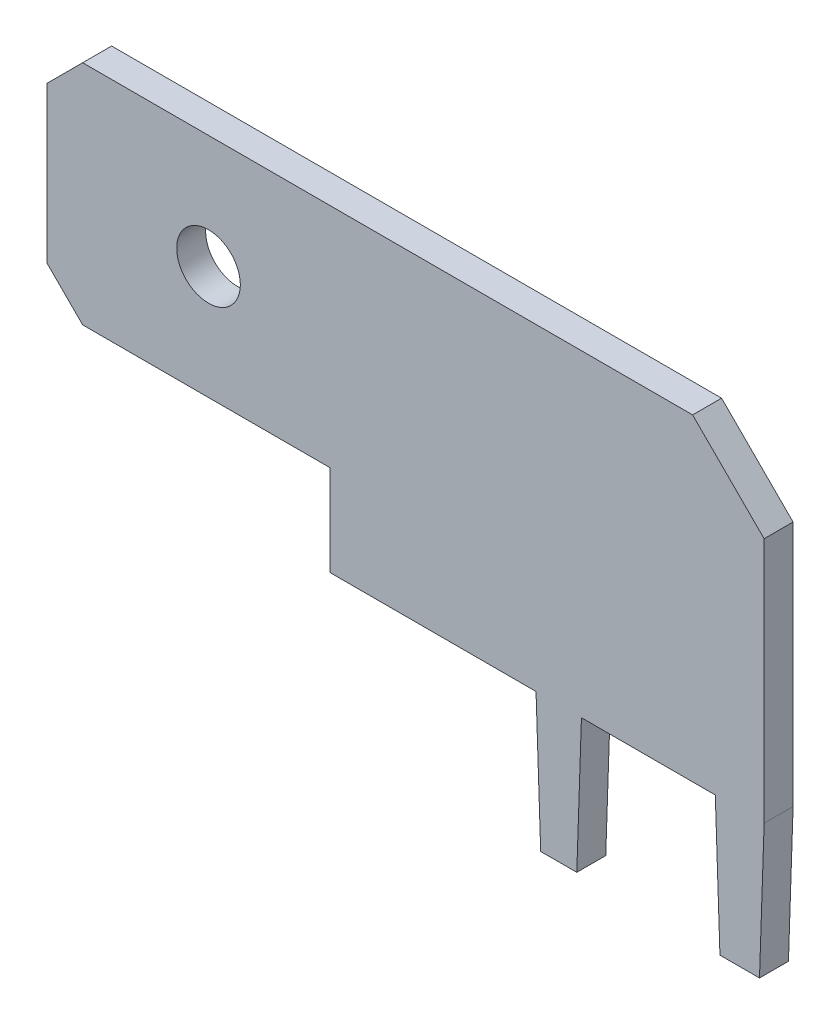
ISO-10303-21;
HEADER;
FILE_DESCRIPTION(('STEP AP214'),'2;1');
FILE_NAME('part.step','',(''),(''),'','','');
FILE_SCHEMA(('AUTOMOTIVE_DESIGN { 1 0 10303 214 1 1 1 1 }'));
ENDSEC;
DATA;
#1=APPLICATION_CONTEXT('core data for automotive mechanical design processes');
#2=APPLICATION_PROTOCOL_DEFINITION('international standard','automotive_design',2000,#1);
#3=PRODUCT_CONTEXT('',#1,'mechanical');
#4=PRODUCT('Part','Part','',(#3));
#5=PRODUCT_RELATED_PRODUCT_CATEGORY('part','',(#4));
#6=PRODUCT_DEFINITION_FORMATION('','',#4);
#7=PRODUCT_DEFINITION_CONTEXT('part definition',#1,'design');
#8=PRODUCT_DEFINITION('design','',#6,#7);
#9=PRODUCT_DEFINITION_SHAPE('','',#8);
#10=(LENGTH_UNIT() NAMED_UNIT(*) SI_UNIT(.MILLI.,.METRE.));
#11=(NAMED_UNIT(*) PLANE_ANGLE_UNIT() SI_UNIT($,.RADIAN.));
#12=(NAMED_UNIT(*) SI_UNIT($,.STERADIAN.) SOLID_ANGLE_UNIT());
#13=UNCERTAINTY_MEASURE_WITH_UNIT(LENGTH_MEASURE(1.E-05),#10,'distance_accuracy_value','');
#14=(GEOMETRIC_REPRESENTATION_CONTEXT(3) GLOBAL_UNCERTAINTY_ASSIGNED_CONTEXT((#13)) GLOBAL_UNIT_ASSIGNED_CONTEXT((#10,
#11,#12)) REPRESENTATION_CONTEXT('',''));
#15=CARTESIAN_POINT('',(0.,0.,0.));
#16=DIRECTION('',(0.,0.,1.));
#17=DIRECTION('',(1.,0.,0.));
#18=AXIS2_PLACEMENT_3D('',#15,#16,#17);
#19=CARTESIAN_POINT('',(-13.1040739404569,11.3618519963259,0.81));
#20=DIRECTION('',(0.707106781186549,-0.707106781186546,0.));
#21=DIRECTION('',(0.707106781186546,0.707106781186549,0.));
#22=AXIS2_PLACEMENT_3D('',#19,#20,#21);
#23=PLANE('',#22);
#24=DIRECTION('',(-0.707106781186546,-0.707106781186549,0.));
#25=VECTOR('',#24,1.);
#26=CARTESIAN_POINT('',(-13.1040739404569,11.3618519963259,0.));
#27=LINE('',#26,#25);
#28=CARTESIAN_POINT('',(-13.1040739404569,11.3618519963259,0.));
#29=VERTEX_POINT('',#28);
#30=CARTESIAN_POINT('',(-14.1040739404569,10.3618519963258,0.));
#31=VERTEX_POINT('',#30);
#32=EDGE_CURVE('E177',#29,#31,#27,.T.);
#33=ORIENTED_EDGE('',*,*,#32,.T.);
#34=DIRECTION('',(0.,0.,-1.));
#35=VECTOR('',#34,1.);
#36=CARTESIAN_POINT('',(-14.1040739404569,10.3618519963258,0.81));
#37=LINE('',#36,#35);
#38=CARTESIAN_POINT('',(-14.1040739404569,10.3618519963258,0.81));
#39=VERTEX_POINT('',#38);
#40=EDGE_CURVE('E11',#39,#31,#37,.T.);
#41=ORIENTED_EDGE('',*,*,#40,.F.);
#42=DIRECTION('',(-0.707106781186546,-0.707106781186549,0.));
#43=VECTOR('',#42,1.);
#44=CARTESIAN_POINT('',(-13.1040739404569,11.3618519963259,0.81));
#45=LINE('',#44,#43);
#46=CARTESIAN_POINT('',(-13.1040739404569,11.3618519963259,0.81));
#47=VERTEX_POINT('',#46);
#48=EDGE_CURVE('E208',#47,#39,#45,.T.);
#49=ORIENTED_EDGE('',*,*,#48,.F.);
#50=DIRECTION('',(0.,0.,-1.));
#51=VECTOR('',#50,1.);
#52=CARTESIAN_POINT('',(-13.1040739404569,11.3618519963259,0.81));
#53=LINE('',#52,#51);
#54=EDGE_CURVE('E173',#47,#29,#53,.T.);
#55=ORIENTED_EDGE('',*,*,#54,.T.);
#56=EDGE_LOOP('',(#33,#41,#49,#55));
#57=FACE_BOUND('',#56,.T.);
#58=ADVANCED_FACE('F33',(#57),#23,.F.);
#59=CARTESIAN_POINT('',(-14.1040739404569,6.01185199632586,0.81));
#60=DIRECTION('',(1.,0.,0.));
#61=DIRECTION('',(0.,1.,0.));
#62=AXIS2_PLACEMENT_3D('',#59,#60,#61);
#63=PLANE('',#62);
#64=DIRECTION('',(0.,-1.,0.));
#65=VECTOR('',#64,1.);
#66=CARTESIAN_POINT('',(-14.1040739404569,6.01185199632586,0.));
#67=LINE('',#66,#65);
#68=CARTESIAN_POINT('',(-14.1040739404569,6.01185199632586,0.));
#69=VERTEX_POINT('',#68);
#70=EDGE_CURVE('E180',#31,#69,#67,.T.);
#71=ORIENTED_EDGE('',*,*,#70,.T.);
#72=DIRECTION('',(0.,0.,-1.));
#73=VECTOR('',#72,1.);
#74=CARTESIAN_POINT('',(-14.1040739404569,6.01185199632586,0.81));
#75=LINE('',#74,#73);
#76=CARTESIAN_POINT('',(-14.1040739404569,6.01185199632586,0.81));
#77=VERTEX_POINT('',#76);
#78=EDGE_CURVE('E41',#77,#69,#75,.T.);
#79=ORIENTED_EDGE('',*,*,#78,.F.);
#80=DIRECTION('',(0.,-1.,0.));
#81=VECTOR('',#80,1.);
#82=CARTESIAN_POINT('',(-14.1040739404569,6.01185199632586,0.81));
#83=LINE('',#82,#81);
#84=EDGE_CURVE('E116',#39,#77,#83,.T.);
#85=ORIENTED_EDGE('',*,*,#84,.F.);
#86=ORIENTED_EDGE('',*,*,#40,.T.);
#87=EDGE_LOOP('',(#71,#79,#85,#86));
#88=FACE_BOUND('',#87,.T.);
#89=ADVANCED_FACE('F307',(#88),#63,.F.);
#90=CARTESIAN_POINT('',(-14.1040739404569,6.01185199632586,0.81));
#91=DIRECTION('',(0.707106781186548,0.707106781186548,0.));
#92=DIRECTION('',(-0.707106781186548,0.707106781186548,0.));
#93=AXIS2_PLACEMENT_3D('',#90,#91,#92);
#94=PLANE('',#93);
#95=DIRECTION('',(0.707106781186547,-0.707106781186547,0.));
#96=VECTOR('',#95,1.);
#97=CARTESIAN_POINT('',(-14.1040739404569,6.01185199632586,0.));
#98=LINE('',#97,#96);
#99=CARTESIAN_POINT('',(-13.1040739404569,5.01185199632586,0.));
#100=VERTEX_POINT('',#99);
#101=EDGE_CURVE('E183',#69,#100,#98,.T.);
#102=ORIENTED_EDGE('',*,*,#101,.T.);
#103=DIRECTION('',(0.,0.,-1.));
#104=VECTOR('',#103,1.);
#105=CARTESIAN_POINT('',(-13.1040739404569,5.01185199632586,0.81));
#106=LINE('',#105,#104);
#107=CARTESIAN_POINT('',(-13.1040739404569,5.01185199632586,0.81));
#108=VERTEX_POINT('',#107);
#109=EDGE_CURVE('E239',#108,#100,#106,.T.);
#110=ORIENTED_EDGE('',*,*,#109,.F.);
#111=DIRECTION('',(0.707106781186547,-0.707106781186547,0.));
#112=VECTOR('',#111,1.);
#113=CARTESIAN_POINT('',(-14.1040739404569,6.01185199632586,0.81));
#114=LINE('',#113,#112);
#115=EDGE_CURVE('E247',#77,#108,#114,.T.);
#116=ORIENTED_EDGE('',*,*,#115,.F.);
#117=ORIENTED_EDGE('',*,*,#78,.T.);
#118=EDGE_LOOP('',(#102,#110,#116,#117));
#119=FACE_BOUND('',#118,.T.);
#120=ADVANCED_FACE('F245',(#119),#94,.F.);
#121=CARTESIAN_POINT('',(-6.18407394045694,5.01185199632586,0.81));
#122=DIRECTION('',(0.,1.,0.));
#123=DIRECTION('',(-1.,0.,0.));
#124=AXIS2_PLACEMENT_3D('',#121,#122,#123);
#125=PLANE('',#124);
#126=DIRECTION('',(1.,0.,0.));
#127=VECTOR('',#126,1.);
#128=CARTESIAN_POINT('',(-6.18407394045694,5.01185199632586,0.));
#129=LINE('',#128,#127);
#130=CARTESIAN_POINT('',(-6.18407394045694,5.01185199632586,0.));
#131=VERTEX_POINT('',#130);
#132=EDGE_CURVE('E185',#100,#131,#129,.T.);
#133=ORIENTED_EDGE('',*,*,#132,.T.);
#134=DIRECTION('',(0.,0.,-1.));
#135=VECTOR('',#134,1.);
#136=CARTESIAN_POINT('',(-6.18407394045694,5.01185199632586,0.81));
#137=LINE('',#136,#135);
#138=CARTESIAN_POINT('',(-6.18407394045694,5.01185199632586,0.81));
#139=VERTEX_POINT('',#138);
#140=EDGE_CURVE('E236',#139,#131,#137,.T.);
#141=ORIENTED_EDGE('',*,*,#140,.F.);
#142=DIRECTION('',(1.,0.,0.));
#143=VECTOR('',#142,1.);
#144=CARTESIAN_POINT('',(-6.18407394045694,5.01185199632586,0.81));
#145=LINE('',#144,#143);
#146=EDGE_CURVE('E265',#108,#139,#145,.T.);
#147=ORIENTED_EDGE('',*,*,#146,.F.);
#148=ORIENTED_EDGE('',*,*,#109,.T.);
#149=EDGE_LOOP('',(#133,#141,#147,#148));
#150=FACE_BOUND('',#149,.T.);
#151=ADVANCED_FACE('F256',(#150),#125,.F.);
#152=CARTESIAN_POINT('',(-6.18407394045694,2.47185199632587,0.81));
#153=DIRECTION('',(1.,0.,0.));
#154=DIRECTION('',(0.,0.,-1.));
#155=AXIS2_PLACEMENT_3D('',#152,#153,#154);
#156=PLANE('',#155);
#157=DIRECTION('',(0.,-1.,0.));
#158=VECTOR('',#157,1.);
#159=CARTESIAN_POINT('',(-6.18407394045694,2.47185199632587,0.));
#160=LINE('',#159,#158);
#161=CARTESIAN_POINT('',(-6.18407394045694,2.47185199632587,0.));
#162=VERTEX_POINT('',#161);
#163=EDGE_CURVE('E187',#131,#162,#160,.T.);
#164=ORIENTED_EDGE('',*,*,#163,.T.);
#165=DIRECTION('',(0.,0.,-1.));
#166=VECTOR('',#165,1.);
#167=CARTESIAN_POINT('',(-6.18407394045694,2.47185199632587,0.81));
#168=LINE('',#167,#166);
#169=CARTESIAN_POINT('',(-6.18407394045694,2.47185199632587,0.81));
#170=VERTEX_POINT('',#169);
#171=EDGE_CURVE('E233',#170,#162,#168,.T.);
#172=ORIENTED_EDGE('',*,*,#171,.F.);
#173=DIRECTION('',(0.,-1.,0.));
#174=VECTOR('',#173,1.);
#175=CARTESIAN_POINT('',(-6.18407394045694,2.47185199632587,0.81));
#176=LINE('',#175,#174);
#177=EDGE_CURVE('E262',#139,#170,#176,.T.);
#178=ORIENTED_EDGE('',*,*,#177,.F.);
#179=ORIENTED_EDGE('',*,*,#140,.T.);
#180=EDGE_LOOP('',(#164,#172,#178,#179));
#181=FACE_BOUND('',#180,.T.);
#182=ADVANCED_FACE('F260',(#181),#156,.F.);
#183=CARTESIAN_POINT('',(-0.423763105620335,2.47185199632587,0.81));
#184=DIRECTION('',(0.,1.,0.));
#185=DIRECTION('',(0.,0.,1.));
#186=AXIS2_PLACEMENT_3D('',#183,#184,#185);
#187=PLANE('',#186);
#188=DIRECTION('',(1.,0.,0.));
#189=VECTOR('',#188,1.);
#190=CARTESIAN_POINT('',(-0.423763105620335,2.47185199632587,0.));
#191=LINE('',#190,#189);
#192=CARTESIAN_POINT('',(-0.423763105620335,2.47185199632587,0.));
#193=VERTEX_POINT('',#192);
#194=EDGE_CURVE('E189',#162,#193,#191,.T.);
#195=ORIENTED_EDGE('',*,*,#194,.T.);
#196=DIRECTION('',(0.,0.,-1.));
#197=VECTOR('',#196,1.);
#198=CARTESIAN_POINT('',(-0.423763105620335,2.47185199632587,0.81));
#199=LINE('',#198,#197);
#200=CARTESIAN_POINT('',(-0.423763105620335,2.47185199632587,0.81));
#201=VERTEX_POINT('',#200);
#202=EDGE_CURVE('E230',#201,#193,#199,.T.);
#203=ORIENTED_EDGE('',*,*,#202,.F.);
#204=DIRECTION('',(1.,0.,0.));
#205=VECTOR('',#204,1.);
#206=CARTESIAN_POINT('',(-0.423763105620335,2.47185199632587,0.81));
#207=LINE('',#206,#205);
#208=EDGE_CURVE('E264',#170,#201,#207,.T.);
#209=ORIENTED_EDGE('',*,*,#208,.F.);
#210=ORIENTED_EDGE('',*,*,#171,.T.);
#211=EDGE_LOOP('',(#195,#203,#209,#210));
#212=FACE_BOUND('',#211,.T.);
#213=ADVANCED_FACE('F320',(#212),#187,.F.);
#214=CARTESIAN_POINT('',(-0.293763105620333,-1.33814800367413,0.81));
#215=DIRECTION('',(0.999418395514089,0.0341008901356521,0.));
#216=DIRECTION('',(-0.0341008901356521,0.999418395514089,0.));
#217=AXIS2_PLACEMENT_3D('',#214,#215,#216);
#218=PLANE('',#217);
#219=DIRECTION('',(0.0341008901356521,-0.999418395514089,0.));
#220=VECTOR('',#219,1.);
#221=CARTESIAN_POINT('',(-0.293763105620333,-1.33814800367413,0.));
#222=LINE('',#221,#220);
#223=CARTESIAN_POINT('',(-0.293763105620333,-1.33814800367413,0.));
#224=VERTEX_POINT('',#223);
#225=EDGE_CURVE('E191',#193,#224,#222,.T.);
#226=ORIENTED_EDGE('',*,*,#225,.T.);
#227=DIRECTION('',(0.,0.,-1.));
#228=VECTOR('',#227,1.);
#229=CARTESIAN_POINT('',(-0.293763105620333,-1.33814800367413,0.81));
#230=LINE('',#229,#228);
#231=CARTESIAN_POINT('',(-0.293763105620333,-1.33814800367413,0.81));
#232=VERTEX_POINT('',#231);
#233=EDGE_CURVE('E227',#232,#224,#230,.T.);
#234=ORIENTED_EDGE('',*,*,#233,.F.);
#235=DIRECTION('',(0.0341008901356521,-0.999418395514089,0.));
#236=VECTOR('',#235,1.);
#237=CARTESIAN_POINT('',(-0.293763105620333,-1.33814800367413,0.81));
#238=LINE('',#237,#236);
#239=EDGE_CURVE('E267',#201,#232,#238,.T.);
#240=ORIENTED_EDGE('',*,*,#239,.F.);
#241=ORIENTED_EDGE('',*,*,#202,.T.);
#242=EDGE_LOOP('',(#226,#234,#240,#241));
#243=FACE_BOUND('',#242,.T.);
#244=ADVANCED_FACE('F323',(#243),#218,.F.);
#245=CARTESIAN_POINT('',(0.716236894379665,-1.33814800367413,0.81));
#246=DIRECTION('',(0.,1.,0.));
#247=DIRECTION('',(-1.,0.,0.));
#248=AXIS2_PLACEMENT_3D('',#245,#246,#247);
#249=PLANE('',#248);
#250=DIRECTION('',(1.,0.,0.));
#251=VECTOR('',#250,1.);
#252=CARTESIAN_POINT('',(0.716236894379665,-1.33814800367413,0.));
#253=LINE('',#252,#251);
#254=CARTESIAN_POINT('',(0.716236894379665,-1.33814800367413,0.));
#255=VERTEX_POINT('',#254);
#256=EDGE_CURVE('E193',#224,#255,#253,.T.);
#257=ORIENTED_EDGE('',*,*,#256,.T.);
#258=DIRECTION('',(0.,0.,-1.));
#259=VECTOR('',#258,1.);
#260=CARTESIAN_POINT('',(0.716236894379665,-1.33814800367413,0.81));
#261=LINE('',#260,#259);
#262=CARTESIAN_POINT('',(0.716236894379665,-1.33814800367413,0.81));
#263=VERTEX_POINT('',#262);
#264=EDGE_CURVE('E224',#263,#255,#261,.T.);
#265=ORIENTED_EDGE('',*,*,#264,.F.);
#266=DIRECTION('',(1.,0.,0.));
#267=VECTOR('',#266,1.);
#268=CARTESIAN_POINT('',(0.716236894379665,-1.33814800367413,0.81));
#269=LINE('',#268,#267);
#270=EDGE_CURVE('E273',#232,#263,#269,.T.);
#271=ORIENTED_EDGE('',*,*,#270,.F.);
#272=ORIENTED_EDGE('',*,*,#233,.T.);
#273=EDGE_LOOP('',(#257,#265,#271,#272));
#274=FACE_BOUND('',#273,.T.);
#275=ADVANCED_FACE('F327',(#274),#249,.F.);
#276=CARTESIAN_POINT('',(0.846236894379665,2.47185199632587,0.81));
#277=DIRECTION('',(-0.999418395514089,0.0341008901356515,0.));
#278=DIRECTION('',(-0.0341008901356515,-0.999418395514089,0.));
#279=AXIS2_PLACEMENT_3D('',#276,#277,#278);
#280=PLANE('',#279);
#281=DIRECTION('',(0.0341008901356515,0.999418395514089,0.));
#282=VECTOR('',#281,1.);
#283=CARTESIAN_POINT('',(0.846236894379665,2.47185199632587,0.));
#284=LINE('',#283,#282);
#285=CARTESIAN_POINT('',(0.846236894379665,2.47185199632587,0.));
#286=VERTEX_POINT('',#285);
#287=EDGE_CURVE('E195',#255,#286,#284,.T.);
#288=ORIENTED_EDGE('',*,*,#287,.T.);
#289=DIRECTION('',(0.,0.,-1.));
#290=VECTOR('',#289,1.);
#291=CARTESIAN_POINT('',(0.846236894379665,2.47185199632587,0.81));
#292=LINE('',#291,#290);
#293=CARTESIAN_POINT('',(0.846236894379665,2.47185199632587,0.81));
#294=VERTEX_POINT('',#293);
#295=EDGE_CURVE('E221',#294,#286,#292,.T.);
#296=ORIENTED_EDGE('',*,*,#295,.F.);
#297=DIRECTION('',(0.0341008901356515,0.999418395514089,0.));
#298=VECTOR('',#297,1.);
#299=CARTESIAN_POINT('',(0.846236894379665,2.47185199632587,0.81));
#300=LINE('',#299,#298);
#301=EDGE_CURVE('E275',#263,#294,#300,.T.);
#302=ORIENTED_EDGE('',*,*,#301,.F.);
#303=ORIENTED_EDGE('',*,*,#264,.T.);
#304=EDGE_LOOP('',(#288,#296,#302,#303));
#305=FACE_BOUND('',#304,.T.);
#306=ADVANCED_FACE('F331',(#305),#280,.F.);
#307=CARTESIAN_POINT('',(4.59024190244428,2.47185199632587,0.81));
#308=DIRECTION('',(0.,1.,0.));
#309=DIRECTION('',(-1.,0.,0.));
#310=AXIS2_PLACEMENT_3D('',#307,#308,#309);
#311=PLANE('',#310);
#312=DIRECTION('',(1.,0.,0.));
#313=VECTOR('',#312,1.);
#314=CARTESIAN_POINT('',(4.59024190244428,2.47185199632587,0.));
#315=LINE('',#314,#313);
#316=CARTESIAN_POINT('',(4.59024190244428,2.47185199632587,0.));
#317=VERTEX_POINT('',#316);
#318=EDGE_CURVE('E197',#286,#317,#315,.T.);
#319=ORIENTED_EDGE('',*,*,#318,.T.);
#320=DIRECTION('',(0.,0.,-1.));
#321=VECTOR('',#320,1.);
#322=CARTESIAN_POINT('',(4.59024190244428,2.47185199632587,0.81));
#323=LINE('',#322,#321);
#324=CARTESIAN_POINT('',(4.59024190244428,2.47185199632587,0.81));
#325=VERTEX_POINT('',#324);
#326=EDGE_CURVE('E218',#325,#317,#323,.T.);
#327=ORIENTED_EDGE('',*,*,#326,.F.);
#328=DIRECTION('',(1.,0.,0.));
#329=VECTOR('',#328,1.);
#330=CARTESIAN_POINT('',(4.59024190244428,2.47185199632587,0.81));
#331=LINE('',#330,#329);
#332=EDGE_CURVE('E277',#294,#325,#331,.T.);
#333=ORIENTED_EDGE('',*,*,#332,.F.);
#334=ORIENTED_EDGE('',*,*,#295,.T.);
#335=EDGE_LOOP('',(#319,#327,#333,#334));
#336=FACE_BOUND('',#335,.T.);
#337=ADVANCED_FACE('F335',(#336),#311,.F.);
#338=CARTESIAN_POINT('',(4.72011335312728,-1.34261608521091,0.81));
#339=DIRECTION('',(0.999420902031673,0.0340273505021642,0.));
#340=DIRECTION('',(-0.0340273505021642,0.999420902031673,0.));
#341=AXIS2_PLACEMENT_3D('',#338,#339,#340);
#342=PLANE('',#341);
#343=DIRECTION('',(0.0340273505021642,-0.999420902031673,0.));
#344=VECTOR('',#343,1.);
#345=CARTESIAN_POINT('',(4.72011335312728,-1.34261608521091,0.));
#346=LINE('',#345,#344);
#347=CARTESIAN_POINT('',(4.72011335312728,-1.34261608521091,0.));
#348=VERTEX_POINT('',#347);
#349=EDGE_CURVE('E199',#317,#348,#346,.T.);
#350=ORIENTED_EDGE('',*,*,#349,.T.);
#351=DIRECTION('',(0.,0.,-1.));
#352=VECTOR('',#351,1.);
#353=CARTESIAN_POINT('',(4.72011335312728,-1.34261608521091,0.81));
#354=LINE('',#353,#352);
#355=CARTESIAN_POINT('',(4.72011335312728,-1.34261608521091,0.81));
#356=VERTEX_POINT('',#355);
#357=EDGE_CURVE('E215',#356,#348,#354,.T.);
#358=ORIENTED_EDGE('',*,*,#357,.F.);
#359=DIRECTION('',(0.0340273505021642,-0.999420902031673,0.));
#360=VECTOR('',#359,1.);
#361=CARTESIAN_POINT('',(4.72011335312728,-1.34261608521091,0.81));
#362=LINE('',#361,#360);
#363=EDGE_CURVE('E279',#325,#356,#362,.T.);
#364=ORIENTED_EDGE('',*,*,#363,.F.);
#365=ORIENTED_EDGE('',*,*,#326,.T.);
#366=EDGE_LOOP('',(#350,#358,#364,#365));
#367=FACE_BOUND('',#366,.T.);
#368=ADVANCED_FACE('F339',(#367),#342,.F.);
#369=CARTESIAN_POINT('',(5.82605460886006,-1.34261608521091,0.81));
#370=DIRECTION('',(0.,1.,0.));
#371=DIRECTION('',(0.,0.,1.));
#372=AXIS2_PLACEMENT_3D('',#369,#370,#371);
#373=PLANE('',#372);
#374=DIRECTION('',(1.,0.,0.));
#375=VECTOR('',#374,1.);
#376=CARTESIAN_POINT('',(5.82605460886006,-1.34261608521091,0.));
#377=LINE('',#376,#375);
#378=CARTESIAN_POINT('',(5.82605460886006,-1.34261608521091,0.));
#379=VERTEX_POINT('',#378);
#380=EDGE_CURVE('E201',#348,#379,#377,.T.);
#381=ORIENTED_EDGE('',*,*,#380,.T.);
#382=DIRECTION('',(0.,0.,-1.));
#383=VECTOR('',#382,1.);
#384=CARTESIAN_POINT('',(5.82605460886006,-1.34261608521091,0.81));
#385=LINE('',#384,#383);
#386=CARTESIAN_POINT('',(5.82605460886006,-1.34261608521091,0.81));
#387=VERTEX_POINT('',#386);
#388=EDGE_CURVE('E212',#387,#379,#385,.T.);
#389=ORIENTED_EDGE('',*,*,#388,.F.);
#390=DIRECTION('',(1.,0.,0.));
#391=VECTOR('',#390,1.);
#392=CARTESIAN_POINT('',(5.82605460886006,-1.34261608521091,0.81));
#393=LINE('',#392,#391);
#394=EDGE_CURVE('E281',#356,#387,#393,.T.);
#395=ORIENTED_EDGE('',*,*,#394,.F.);
#396=ORIENTED_EDGE('',*,*,#357,.T.);
#397=EDGE_LOOP('',(#381,#389,#395,#396));
#398=FACE_BOUND('',#397,.T.);
#399=ADVANCED_FACE('F287',(#398),#373,.F.);
#400=CARTESIAN_POINT('',(5.95592605954307,2.47185199632587,0.81));
#401=DIRECTION('',(-0.999420902031673,0.034027350502164,0.));
#402=DIRECTION('',(-0.034027350502164,-0.999420902031673,0.));
#403=AXIS2_PLACEMENT_3D('',#400,#401,#402);
#404=PLANE('',#403);
#405=DIRECTION('',(0.034027350502164,0.999420902031673,0.));
#406=VECTOR('',#405,1.);
#407=CARTESIAN_POINT('',(5.95592605954307,2.47185199632587,0.));
#408=LINE('',#407,#406);
#409=CARTESIAN_POINT('',(5.95592605954307,2.47185199632587,0.));
#410=VERTEX_POINT('',#409);
#411=EDGE_CURVE('E203',#379,#410,#408,.T.);
#412=ORIENTED_EDGE('',*,*,#411,.T.);
#413=DIRECTION('',(0.,0.,-1.));
#414=VECTOR('',#413,1.);
#415=CARTESIAN_POINT('',(5.95592605954307,2.47185199632587,0.81));
#416=LINE('',#415,#414);
#417=CARTESIAN_POINT('',(5.95592605954307,2.47185199632587,0.81));
#418=VERTEX_POINT('',#417);
#419=EDGE_CURVE('E168',#418,#410,#416,.T.);
#420=ORIENTED_EDGE('',*,*,#419,.F.);
#421=DIRECTION('',(0.034027350502164,0.999420902031673,0.));
#422=VECTOR('',#421,1.);
#423=CARTESIAN_POINT('',(5.95592605954307,2.47185199632587,0.81));
#424=LINE('',#423,#422);
#425=EDGE_CURVE('E159',#387,#418,#424,.T.);
#426=ORIENTED_EDGE('',*,*,#425,.F.);
#427=ORIENTED_EDGE('',*,*,#388,.T.);
#428=EDGE_LOOP('',(#412,#420,#426,#427));
#429=FACE_BOUND('',#428,.T.);
#430=ADVANCED_FACE('F291',(#429),#404,.F.);
#431=CARTESIAN_POINT('',(5.95592605954307,9.36185199632585,0.81));
#432=DIRECTION('',(-1.,0.,0.));
#433=DIRECTION('',(0.,-1.,0.));
#434=AXIS2_PLACEMENT_3D('',#431,#432,#433);
#435=PLANE('',#434);
#436=DIRECTION('',(0.,1.,0.));
#437=VECTOR('',#436,1.);
#438=CARTESIAN_POINT('',(5.95592605954307,9.36185199632585,0.));
#439=LINE('',#438,#437);
#440=CARTESIAN_POINT('',(5.95592605954307,9.36185199632585,0.));
#441=VERTEX_POINT('',#440);
#442=EDGE_CURVE('E167',#410,#441,#439,.T.);
#443=ORIENTED_EDGE('',*,*,#442,.T.);
#444=DIRECTION('',(0.,0.,-1.));
#445=VECTOR('',#444,1.);
#446=CARTESIAN_POINT('',(5.95592605954307,9.36185199632585,0.81));
#447=LINE('',#446,#445);
#448=CARTESIAN_POINT('',(5.95592605954307,9.36185199632585,0.81));
#449=VERTEX_POINT('',#448);
#450=EDGE_CURVE('E164',#449,#441,#447,.T.);
#451=ORIENTED_EDGE('',*,*,#450,.F.);
#452=DIRECTION('',(0.,1.,0.));
#453=VECTOR('',#452,1.);
#454=CARTESIAN_POINT('',(5.95592605954307,9.36185199632585,0.81));
#455=LINE('',#454,#453);
#456=EDGE_CURVE('E153',#418,#449,#455,.T.);
#457=ORIENTED_EDGE('',*,*,#456,.F.);
#458=ORIENTED_EDGE('',*,*,#419,.T.);
#459=EDGE_LOOP('',(#443,#451,#457,#458));
#460=FACE_BOUND('',#459,.T.);
#461=ADVANCED_FACE('F165',(#460),#435,.F.);
#462=CARTESIAN_POINT('',(3.95592605954305,11.3618519963259,0.81));
#463=DIRECTION('',(-0.707106781186545,-0.70710678118655,0.));
#464=DIRECTION('',(0.70710678118655,-0.707106781186545,0.));
#465=AXIS2_PLACEMENT_3D('',#462,#463,#464);
#466=PLANE('',#465);
#467=DIRECTION('',(-0.70710678118655,0.707106781186545,0.));
#468=VECTOR('',#467,1.);
#469=CARTESIAN_POINT('',(3.95592605954305,11.3618519963259,0.));
#470=LINE('',#469,#468);
#471=CARTESIAN_POINT('',(3.95592605954305,11.3618519963259,0.));
#472=VERTEX_POINT('',#471);
#473=EDGE_CURVE('E102',#441,#472,#470,.T.);
#474=ORIENTED_EDGE('',*,*,#473,.T.);
#475=DIRECTION('',(0.,0.,-1.));
#476=VECTOR('',#475,1.);
#477=CARTESIAN_POINT('',(3.95592605954305,11.3618519963259,0.81));
#478=LINE('',#477,#476);
#479=CARTESIAN_POINT('',(3.95592605954305,11.3618519963259,0.81));
#480=VERTEX_POINT('',#479);
#481=EDGE_CURVE('E169',#480,#472,#478,.T.);
#482=ORIENTED_EDGE('',*,*,#481,.F.);
#483=DIRECTION('',(-0.70710678118655,0.707106781186545,0.));
#484=VECTOR('',#483,1.);
#485=CARTESIAN_POINT('',(3.95592605954305,11.3618519963259,0.81));
#486=LINE('',#485,#484);
#487=EDGE_CURVE('E157',#449,#480,#486,.T.);
#488=ORIENTED_EDGE('',*,*,#487,.F.);
#489=ORIENTED_EDGE('',*,*,#450,.T.);
#490=EDGE_LOOP('',(#474,#482,#488,#489));
#491=FACE_BOUND('',#490,.T.);
#492=ADVANCED_FACE('F171',(#491),#466,.F.);
#493=CARTESIAN_POINT('',(-13.1040739404569,11.3618519963259,0.81));
#494=DIRECTION('',(0.,-1.,0.));
#495=DIRECTION('',(1.,0.,0.));
#496=AXIS2_PLACEMENT_3D('',#493,#494,#495);
#497=PLANE('',#496);
#498=DIRECTION('',(-1.,0.,0.));
#499=VECTOR('',#498,1.);
#500=CARTESIAN_POINT('',(-13.1040739404569,11.3618519963259,0.));
#501=LINE('',#500,#499);
#502=EDGE_CURVE('E108',#472,#29,#501,.T.);
#503=ORIENTED_EDGE('',*,*,#502,.T.);
#504=ORIENTED_EDGE('',*,*,#54,.F.);
#505=DIRECTION('',(-1.,0.,0.));
#506=VECTOR('',#505,1.);
#507=CARTESIAN_POINT('',(-13.1040739404569,11.3618519963259,0.81));
#508=LINE('',#507,#506);
#509=EDGE_CURVE('E49',#480,#47,#508,.T.);
#510=ORIENTED_EDGE('',*,*,#509,.F.);
#511=ORIENTED_EDGE('',*,*,#481,.T.);
#512=EDGE_LOOP('',(#503,#504,#510,#511));
#513=FACE_BOUND('',#512,.T.);
#514=ADVANCED_FACE('F295',(#513),#497,.F.);
#515=CARTESIAN_POINT('',(-16.2790739404569,8.18685199632585,0.81));
#516=DIRECTION('',(0.,0.,1.));
#517=DIRECTION('',(1.,0.,0.));
#518=AXIS2_PLACEMENT_3D('',#515,#516,#517);
#519=PLANE('',#518);
#520=CARTESIAN_POINT('',(-9.58407394045694,8.18685199632586,0.81));
#521=DIRECTION('',(0.,0.,1.));
#522=DIRECTION('',(1.,0.,0.));
#523=AXIS2_PLACEMENT_3D('',#520,#521,#522);
#524=CIRCLE('',#523,0.89);
#525=CARTESIAN_POINT('',(-8.69407394045693,8.18685199632586,0.81));
#526=VERTEX_POINT('',#525);
#527=EDGE_CURVE('E394',#526,#526,#524,.T.);
#528=ORIENTED_EDGE('',*,*,#527,.F.);
#529=EDGE_LOOP('',(#528));
#530=FACE_BOUND('',#529,.T.);
#531=ORIENTED_EDGE('',*,*,#48,.T.);
#532=ORIENTED_EDGE('',*,*,#84,.T.);
#533=ORIENTED_EDGE('',*,*,#115,.T.);
#534=ORIENTED_EDGE('',*,*,#146,.T.);
#535=ORIENTED_EDGE('',*,*,#177,.T.);
#536=ORIENTED_EDGE('',*,*,#208,.T.);
#537=ORIENTED_EDGE('',*,*,#239,.T.);
#538=ORIENTED_EDGE('',*,*,#270,.T.);
#539=ORIENTED_EDGE('',*,*,#301,.T.);
#540=ORIENTED_EDGE('',*,*,#332,.T.);
#541=ORIENTED_EDGE('',*,*,#363,.T.);
#542=ORIENTED_EDGE('',*,*,#394,.T.);
#543=ORIENTED_EDGE('',*,*,#425,.T.);
#544=ORIENTED_EDGE('',*,*,#456,.T.);
#545=ORIENTED_EDGE('',*,*,#487,.T.);
#546=ORIENTED_EDGE('',*,*,#509,.T.);
#547=EDGE_LOOP('',(#531,#532,#533,#534,#535,#536,#537,#538,#539,#540,#541,#542,#543,#544,#545,#546));
#548=FACE_BOUND('',#547,.T.);
#549=ADVANCED_FACE('F155',(#530,#548),#519,.T.);
#550=CARTESIAN_POINT('',(-16.2790739404569,8.18685199632585,0.));
#551=DIRECTION('',(0.,0.,1.));
#552=DIRECTION('',(1.,0.,0.));
#553=AXIS2_PLACEMENT_3D('',#550,#551,#552);
#554=PLANE('',#553);
#555=CARTESIAN_POINT('',(-9.58407394045694,8.18685199632586,0.));
#556=DIRECTION('',(0.,0.,1.));
#557=DIRECTION('',(1.,0.,0.));
#558=AXIS2_PLACEMENT_3D('',#555,#556,#557);
#559=CIRCLE('',#558,0.89);
#560=CARTESIAN_POINT('',(-8.69407394045693,8.18685199632586,0.));
#561=VERTEX_POINT('',#560);
#562=EDGE_CURVE('E181',#561,#561,#559,.T.);
#563=ORIENTED_EDGE('',*,*,#562,.T.);
#564=EDGE_LOOP('',(#563));
#565=FACE_BOUND('',#564,.T.);
#566=ORIENTED_EDGE('',*,*,#32,.F.);
#567=ORIENTED_EDGE('',*,*,#502,.F.);
#568=ORIENTED_EDGE('',*,*,#473,.F.);
#569=ORIENTED_EDGE('',*,*,#442,.F.);
#570=ORIENTED_EDGE('',*,*,#411,.F.);
#571=ORIENTED_EDGE('',*,*,#380,.F.);
#572=ORIENTED_EDGE('',*,*,#349,.F.);
#573=ORIENTED_EDGE('',*,*,#318,.F.);
#574=ORIENTED_EDGE('',*,*,#287,.F.);
#575=ORIENTED_EDGE('',*,*,#256,.F.);
#576=ORIENTED_EDGE('',*,*,#225,.F.);
#577=ORIENTED_EDGE('',*,*,#194,.F.);
#578=ORIENTED_EDGE('',*,*,#163,.F.);
#579=ORIENTED_EDGE('',*,*,#132,.F.);
#580=ORIENTED_EDGE('',*,*,#101,.F.);
#581=ORIENTED_EDGE('',*,*,#70,.F.);
#582=EDGE_LOOP('',(#566,#567,#568,#569,#570,#571,#572,#573,#574,#575,#576,#577,#578,#579,#580,#581));
#583=FACE_BOUND('',#582,.T.);
#584=ADVANCED_FACE('F251',(#565,#583),#554,.F.);
#585=CARTESIAN_POINT('',(-9.58407394045694,8.18685199632586,0.));
#586=DIRECTION('',(0.,0.,1.));
#587=DIRECTION('',(1.,0.,0.));
#588=AXIS2_PLACEMENT_3D('',#585,#586,#587);
#589=CYLINDRICAL_SURFACE('',#588,0.89);
#590=ORIENTED_EDGE('',*,*,#562,.F.);
#591=EDGE_LOOP('',(#590));
#592=FACE_BOUND('',#591,.T.);
#593=ORIENTED_EDGE('',*,*,#527,.T.);
#594=EDGE_LOOP('',(#593));
#595=FACE_BOUND('',#594,.T.);
#596=ADVANCED_FACE('F376',(#592,#595),#589,.F.);
#597=CLOSED_SHELL('',(#58,#89,#120,#151,#182,#213,#244,#275,#306,#337,#368,#399,#430,#461,#492,
#514,#549,#584,#596));
#598=MANIFOLD_SOLID_BREP('B2',#597);
#599=ADVANCED_BREP_SHAPE_REPRESENTATION('',(#18,#598),#14);
#600=SHAPE_DEFINITION_REPRESENTATION(#9,#599);
ENDSEC;
END-ISO-10303-21;
